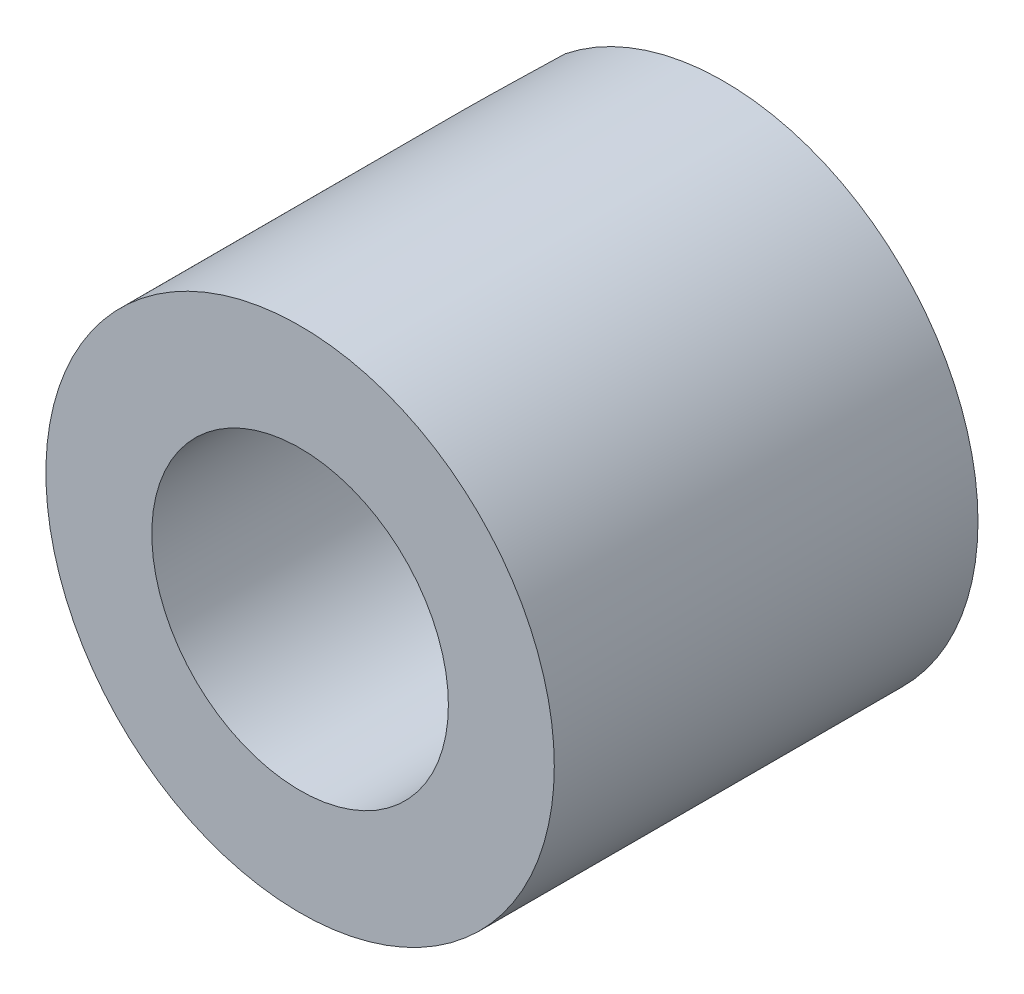
ISO-10303-21;
HEADER;
FILE_DESCRIPTION(('STEP AP214'),'2;1');
FILE_NAME('part.step','',(''),(''),'','','');
FILE_SCHEMA(('AUTOMOTIVE_DESIGN { 1 0 10303 214 1 1 1 1 }'));
ENDSEC;
DATA;
#1=APPLICATION_CONTEXT('core data for automotive mechanical design processes');
#2=APPLICATION_PROTOCOL_DEFINITION('international standard','automotive_design',2000,#1);
#3=PRODUCT_CONTEXT('',#1,'mechanical');
#4=PRODUCT('Part','Part','',(#3));
#5=PRODUCT_RELATED_PRODUCT_CATEGORY('part','',(#4));
#6=PRODUCT_DEFINITION_FORMATION('','',#4);
#7=PRODUCT_DEFINITION_CONTEXT('part definition',#1,'design');
#8=PRODUCT_DEFINITION('design','',#6,#7);
#9=PRODUCT_DEFINITION_SHAPE('','',#8);
#10=(LENGTH_UNIT() NAMED_UNIT(*) SI_UNIT(.MILLI.,.METRE.));
#11=(NAMED_UNIT(*) PLANE_ANGLE_UNIT() SI_UNIT($,.RADIAN.));
#12=(NAMED_UNIT(*) SI_UNIT($,.STERADIAN.) SOLID_ANGLE_UNIT());
#13=UNCERTAINTY_MEASURE_WITH_UNIT(LENGTH_MEASURE(1.E-05),#10,'distance_accuracy_value','');
#14=(GEOMETRIC_REPRESENTATION_CONTEXT(3) GLOBAL_UNCERTAINTY_ASSIGNED_CONTEXT((#13)) GLOBAL_UNIT_ASSIGNED_CONTEXT((#10,
#11,#12)) REPRESENTATION_CONTEXT('',''));
#15=CARTESIAN_POINT('',(0.,0.,0.));
#16=DIRECTION('',(0.,0.,1.));
#17=DIRECTION('',(1.,0.,0.));
#18=AXIS2_PLACEMENT_3D('',#15,#16,#17);
#19=CARTESIAN_POINT('',(0.,0.,5.));
#20=DIRECTION('',(0.,0.,1.));
#21=DIRECTION('',(1.,0.,0.));
#22=AXIS2_PLACEMENT_3D('',#19,#20,#21);
#23=PLANE('',#22);
#24=CARTESIAN_POINT('',(0.,0.,5.));
#25=DIRECTION('',(0.,0.,1.));
#26=DIRECTION('',(1.,0.,0.));
#27=AXIS2_PLACEMENT_3D('',#24,#25,#26);
#28=CIRCLE('',#27,3.);
#29=CARTESIAN_POINT('',(3.,0.,5.));
#30=VERTEX_POINT('',#29);
#31=EDGE_CURVE('E47',#30,#30,#28,.T.);
#32=ORIENTED_EDGE('',*,*,#31,.T.);
#33=EDGE_LOOP('',(#32));
#34=FACE_BOUND('',#33,.T.);
#35=CARTESIAN_POINT('',(0.,0.,5.));
#36=DIRECTION('',(0.,0.,1.));
#37=DIRECTION('',(1.,0.,0.));
#38=AXIS2_PLACEMENT_3D('',#35,#36,#37);
#39=CIRCLE('',#38,1.75);
#40=CARTESIAN_POINT('',(1.75,0.,5.));
#41=VERTEX_POINT('',#40);
#42=EDGE_CURVE('E64',#41,#41,#39,.T.);
#43=ORIENTED_EDGE('',*,*,#42,.F.);
#44=EDGE_LOOP('',(#43));
#45=FACE_BOUND('',#44,.T.);
#46=ADVANCED_FACE('F34',(#34,#45),#23,.T.);
#47=CARTESIAN_POINT('',(0.,0.,0.));
#48=DIRECTION('',(0.,0.,1.));
#49=DIRECTION('',(1.,0.,0.));
#50=AXIS2_PLACEMENT_3D('',#47,#48,#49);
#51=PLANE('',#50);
#52=CARTESIAN_POINT('',(0.,0.,0.));
#53=DIRECTION('',(0.,0.,1.));
#54=DIRECTION('',(1.,0.,0.));
#55=AXIS2_PLACEMENT_3D('',#52,#53,#54);
#56=CIRCLE('',#55,3.);
#57=CARTESIAN_POINT('',(-1.87179676972449,-2.34443529508685,0.));
#58=VERTEX_POINT('',#57);
#59=CARTESIAN_POINT('',(-1.87179676972449,2.34443529508685,0.));
#60=VERTEX_POINT('',#59);
#61=EDGE_CURVE('E61',#58,#60,#56,.T.);
#62=ORIENTED_EDGE('',*,*,#61,.F.);
#63=DIRECTION('',(0.,1.,0.));
#64=VECTOR('',#63,1.);
#65=CARTESIAN_POINT('',(-1.87179676972449,-5.,0.));
#66=LINE('',#65,#64);
#67=EDGE_CURVE('E53',#58,#60,#66,.T.);
#68=ORIENTED_EDGE('',*,*,#67,.T.);
#69=EDGE_LOOP('',(#62,#68));
#70=FACE_BOUND('',#69,.T.);
#71=CARTESIAN_POINT('',(0.,0.,0.));
#72=DIRECTION('',(0.,0.,1.));
#73=DIRECTION('',(1.,0.,0.));
#74=AXIS2_PLACEMENT_3D('',#71,#72,#73);
#75=CIRCLE('',#74,1.75);
#76=CARTESIAN_POINT('',(1.75,0.,0.));
#77=VERTEX_POINT('',#76);
#78=EDGE_CURVE('E62',#77,#77,#75,.T.);
#79=ORIENTED_EDGE('',*,*,#78,.T.);
#80=EDGE_LOOP('',(#79));
#81=FACE_BOUND('',#80,.T.);
#82=ADVANCED_FACE('F59',(#70,#81),#51,.F.);
#83=CARTESIAN_POINT('',(0.,0.,5.));
#84=DIRECTION('',(0.,0.,-1.));
#85=DIRECTION('',(-1.,0.,0.));
#86=AXIS2_PLACEMENT_3D('',#83,#84,#85);
#87=CYLINDRICAL_SURFACE('',#86,3.);
#88=ORIENTED_EDGE('',*,*,#31,.F.);
#89=EDGE_LOOP('',(#88));
#90=FACE_BOUND('',#89,.T.);
#91=ORIENTED_EDGE('',*,*,#61,.T.);
#92=CARTESIAN_POINT('',(-1.87179676972449,2.34443529508685,0.));
#93=CARTESIAN_POINT('',(-1.88074933741455,2.33728476735633,0.0620287119447855));
#94=CARTESIAN_POINT('',(-1.89052352754949,2.32940024318606,0.123849734071447));
#95=CARTESIAN_POINT('',(-1.91168442466181,2.31206662503211,0.247001295833658));
#96=CARTESIAN_POINT('',(-1.92307131077382,2.30261735722047,0.308331780180762));
#97=CARTESIAN_POINT('',(-1.95965091415942,2.27173856414817,0.491701092775742));
#98=CARTESIAN_POINT('',(-1.98722610467206,2.2478061961511,0.612866108575726));
#99=CARTESIAN_POINT('',(-2.04865500421913,2.19197577646782,0.853353841995063));
#100=CARTESIAN_POINT('',(-2.08257962073946,2.15998619323443,0.972637395633714));
#101=CARTESIAN_POINT('',(-2.15575692995754,2.08695426949177,1.20659098829699));
#102=CARTESIAN_POINT('',(-2.1950039485214,2.04592154101209,1.32126577413539));
#103=CARTESIAN_POINT('',(-2.2876594193316,1.94230579072023,1.57120335151079));
#104=CARTESIAN_POINT('',(-2.34222033035107,1.87692043247359,1.70490939046505));
#105=CARTESIAN_POINT('',(-2.45471502076116,1.72716218952217,1.95914713615149));
#106=CARTESIAN_POINT('',(-2.51263409306936,1.64286805425286,2.07973048719967));
#107=CARTESIAN_POINT('',(-2.61544573046948,1.47214770903493,2.28044561594911));
#108=CARTESIAN_POINT('',(-2.66057774396084,1.38969054080827,2.36380501325348));
#109=CARTESIAN_POINT('',(-2.74668836332077,1.21059277110405,2.51640139639137));
#110=CARTESIAN_POINT('',(-2.78767013630481,1.11396312486803,2.58564919249606));
#111=CARTESIAN_POINT('',(-2.85504600114549,0.925675643199321,2.69607482691308));
#112=CARTESIAN_POINT('',(-2.8827380279114,0.836128321411231,2.74004697946733));
#113=CARTESIAN_POINT('',(-2.93040290622826,0.64960129701191,2.81441880968996));
#114=CARTESIAN_POINT('',(-2.95037915876362,0.552624891656832,2.84482446816152));
#115=CARTESIAN_POINT('',(-2.9808433301658,0.353244815605846,2.89078356069575));
#116=CARTESIAN_POINT('',(-2.99128641076997,0.250817871504164,2.90626682769241));
#117=CARTESIAN_POINT('',(-3.00145257635679,0.0442743823682046,2.92134403224051));
#118=CARTESIAN_POINT('',(-3.0011784648615,-0.0598417136754921,2.92094212521181));
#119=CARTESIAN_POINT('',(-2.99041047489795,-0.257849969657977,2.90496332657009));
#120=CARTESIAN_POINT('',(-2.98074120586819,-0.351890367711473,2.89061083634469));
#121=CARTESIAN_POINT('',(-2.95322434518918,-0.535833034951507,2.84913336300258));
#122=CARTESIAN_POINT('',(-2.93537682921355,-0.625735342419475,2.82200849806906));
#123=CARTESIAN_POINT('',(-2.89236028263366,-0.801670022479395,2.75518271882283));
#124=CARTESIAN_POINT('',(-2.86701128341652,-0.887538757482863,2.71517023960376));
#125=CARTESIAN_POINT('',(-2.81105915239756,-1.05140841560359,2.6242844725293));
#126=CARTESIAN_POINT('',(-2.7804537445764,-1.12940590715695,2.57340647758409));
#127=CARTESIAN_POINT('',(-2.7019054835963,-1.30882128555795,2.43826368554602));
#128=CARTESIAN_POINT('',(-2.65219226521181,-1.40576341074723,2.34907980435898));
#129=CARTESIAN_POINT('',(-2.55081138132965,-1.58233854439102,2.15587841747699));
#130=CARTESIAN_POINT('',(-2.49913995017046,-1.66193598557506,2.0518311422938));
#131=CARTESIAN_POINT('',(-2.41228665848174,-1.78459014669409,1.86435697965833));
#132=CARTESIAN_POINT('',(-2.37664733785864,-1.83156445851959,1.78363839342386));
#133=CARTESIAN_POINT('',(-2.30721864315838,-1.91828880208474,1.61760979533661));
#134=CARTESIAN_POINT('',(-2.27343014756656,-1.9580354236455,1.53229764061686));
#135=CARTESIAN_POINT('',(-2.20838691197256,-2.03111434254849,1.35782264399032));
#136=CARTESIAN_POINT('',(-2.17713775078872,-2.06443272668105,1.26865194990934));
#137=CARTESIAN_POINT('',(-2.11777326250348,-2.12528556751513,1.08733325030257));
#138=CARTESIAN_POINT('',(-2.08965900487323,-2.1528180531761,0.995184242470698));
#139=CARTESIAN_POINT('',(-2.02200952765732,-2.2169217359716,0.755536953329127));
#140=CARTESIAN_POINT('',(-1.98504187536684,-2.24976125677183,0.606292125241536));
#141=CARTESIAN_POINT('',(-1.93697014254126,-2.29097683044425,0.380119054834942));
#142=CARTESIAN_POINT('',(-1.92221745432244,-2.30334354311549,0.304628167943324));
#143=CARTESIAN_POINT('',(-1.89515854502282,-2.32565640085766,0.152865607953595));
#144=CARTESIAN_POINT('',(-1.88285194959216,-2.3356029163677,0.0765940562099234));
#145=CARTESIAN_POINT('',(-1.87179676972449,-2.34443529508685,0.));
#146=B_SPLINE_CURVE_WITH_KNOTS('',3,(#92,#93,#94,#95,#96,#97,#98,#99,#100,#101,#102,#103,#104,
#105,#106,#107,#108,#109,#110,#111,#112,#113,#114,#115,#116,#117,#118,#119,#120,#121,#122,#123,
#124,#125,#126,#127,#128,#129,#130,#131,#132,#133,#134,#135,#136,#137,#138,#139,#140,#141,#142,
#143,#144,#145),.UNSPECIFIED.,.F.,.F.,(4,2,2,2,2,2,2,2,2,2,2,2,2,2,2,2,2,2,2,2,2,2,2,2,2,2,4),
(0.,0.189214126545451,0.378449287078281,0.757685276919647,1.14144078857325,1.52479035403251,
1.9989363150249,2.4711430996845,2.84668264015802,3.22193340596128,3.53123893839577,
3.84040797810615,4.15102377979714,4.46155832770267,4.74709055173401,5.03262013377874,
5.32564830695443,5.61880368238392,6.03884962172351,6.45974897266493,6.75924882813487,
7.05888962945368,7.35917186833591,7.65955623698125,8.13032940231002,8.36398761707545,
8.5976100452252),.UNSPECIFIED.);
#147=EDGE_CURVE('E11',#60,#58,#146,.T.);
#148=ORIENTED_EDGE('',*,*,#147,.T.);
#149=EDGE_LOOP('',(#91,#148));
#150=FACE_BOUND('',#149,.T.);
#151=ADVANCED_FACE('F36',(#90,#150),#87,.T.);
#152=CARTESIAN_POINT('',(0.,0.,5.));
#153=DIRECTION('',(0.,0.,-1.));
#154=DIRECTION('',(-1.,0.,0.));
#155=AXIS2_PLACEMENT_3D('',#152,#153,#154);
#156=CYLINDRICAL_SURFACE('',#155,1.75);
#157=ORIENTED_EDGE('',*,*,#42,.T.);
#158=EDGE_LOOP('',(#157));
#159=FACE_BOUND('',#158,.T.);
#160=ORIENTED_EDGE('',*,*,#78,.F.);
#161=EDGE_LOOP('',(#160));
#162=FACE_BOUND('',#161,.T.);
#163=ADVANCED_FACE('F73',(#159,#162),#156,.F.);
#164=CARTESIAN_POINT('',(-8.8,-5.,-1.));
#165=DIRECTION('',(0.,1.,0.));
#166=DIRECTION('',(0.,0.,1.));
#167=AXIS2_PLACEMENT_3D('',#164,#165,#166);
#168=CYLINDRICAL_SURFACE('',#167,7.);
#169=ORIENTED_EDGE('',*,*,#147,.F.);
#170=ORIENTED_EDGE('',*,*,#67,.F.);
#171=EDGE_LOOP('',(#169,#170));
#172=FACE_BOUND('',#171,.T.);
#173=ADVANCED_FACE('F54',(#172),#168,.F.);
#174=CLOSED_SHELL('',(#46,#82,#151,#163,#173));
#175=MANIFOLD_SOLID_BREP('B2',#174);
#176=ADVANCED_BREP_SHAPE_REPRESENTATION('',(#18,#175),#14);
#177=SHAPE_DEFINITION_REPRESENTATION(#9,#176);
ENDSEC;
END-ISO-10303-21;
